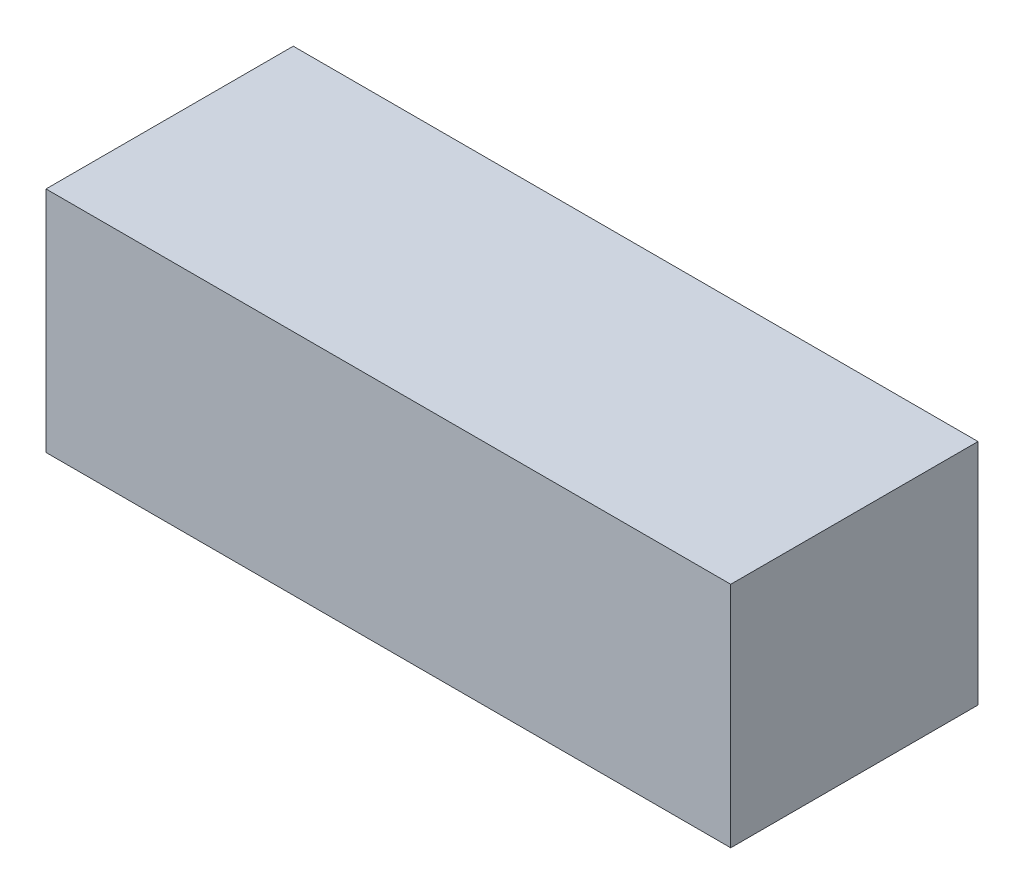
ISO-10303-21;
HEADER;
FILE_DESCRIPTION(('STEP AP214'),'2;1');
FILE_NAME('part.step','',(''),(''),'','','');
FILE_SCHEMA(('AUTOMOTIVE_DESIGN { 1 0 10303 214 1 1 1 1 }'));
ENDSEC;
DATA;
#1=APPLICATION_CONTEXT('core data for automotive mechanical design processes');
#2=APPLICATION_PROTOCOL_DEFINITION('international standard','automotive_design',2000,#1);
#3=PRODUCT_CONTEXT('',#1,'mechanical');
#4=PRODUCT('Part','Part','',(#3));
#5=PRODUCT_RELATED_PRODUCT_CATEGORY('part','',(#4));
#6=PRODUCT_DEFINITION_FORMATION('','',#4);
#7=PRODUCT_DEFINITION_CONTEXT('part definition',#1,'design');
#8=PRODUCT_DEFINITION('design','',#6,#7);
#9=PRODUCT_DEFINITION_SHAPE('','',#8);
#10=(LENGTH_UNIT() NAMED_UNIT(*) SI_UNIT(.MILLI.,.METRE.));
#11=(NAMED_UNIT(*) PLANE_ANGLE_UNIT() SI_UNIT($,.RADIAN.));
#12=(NAMED_UNIT(*) SI_UNIT($,.STERADIAN.) SOLID_ANGLE_UNIT());
#13=UNCERTAINTY_MEASURE_WITH_UNIT(LENGTH_MEASURE(1.E-05),#10,'distance_accuracy_value','');
#14=(GEOMETRIC_REPRESENTATION_CONTEXT(3) GLOBAL_UNCERTAINTY_ASSIGNED_CONTEXT((#13)) GLOBAL_UNIT_ASSIGNED_CONTEXT((#10,
#11,#12)) REPRESENTATION_CONTEXT('',''));
#15=CARTESIAN_POINT('',(0.,0.,0.));
#16=DIRECTION('',(0.,0.,1.));
#17=DIRECTION('',(1.,0.,0.));
#18=AXIS2_PLACEMENT_3D('',#15,#16,#17);
#19=CARTESIAN_POINT('',(90.,60.,32.5));
#20=DIRECTION('',(-1.,0.,0.));
#21=DIRECTION('',(0.,0.,1.));
#22=AXIS2_PLACEMENT_3D('',#19,#20,#21);
#23=PLANE('',#22);
#24=DIRECTION('',(0.,0.,-1.));
#25=VECTOR('',#24,1.);
#26=CARTESIAN_POINT('',(90.,0.,32.5));
#27=LINE('',#26,#25);
#28=CARTESIAN_POINT('',(90.,0.,32.5));
#29=VERTEX_POINT('',#28);
#30=CARTESIAN_POINT('',(90.,0.,-32.5));
#31=VERTEX_POINT('',#30);
#32=EDGE_CURVE('E111',#29,#31,#27,.T.);
#33=ORIENTED_EDGE('',*,*,#32,.T.);
#34=DIRECTION('',(0.,-1.,0.));
#35=VECTOR('',#34,1.);
#36=CARTESIAN_POINT('',(90.,60.,-32.5));
#37=LINE('',#36,#35);
#38=CARTESIAN_POINT('',(90.,60.,-32.5));
#39=VERTEX_POINT('',#38);
#40=EDGE_CURVE('E11',#39,#31,#37,.T.);
#41=ORIENTED_EDGE('',*,*,#40,.F.);
#42=DIRECTION('',(0.,0.,-1.));
#43=VECTOR('',#42,1.);
#44=CARTESIAN_POINT('',(90.,60.,32.5));
#45=LINE('',#44,#43);
#46=CARTESIAN_POINT('',(90.,60.,32.5));
#47=VERTEX_POINT('',#46);
#48=EDGE_CURVE('E95',#47,#39,#45,.T.);
#49=ORIENTED_EDGE('',*,*,#48,.F.);
#50=DIRECTION('',(0.,-1.,0.));
#51=VECTOR('',#50,1.);
#52=CARTESIAN_POINT('',(90.,60.,32.5));
#53=LINE('',#52,#51);
#54=EDGE_CURVE('E107',#47,#29,#53,.T.);
#55=ORIENTED_EDGE('',*,*,#54,.T.);
#56=EDGE_LOOP('',(#33,#41,#49,#55));
#57=FACE_BOUND('',#56,.T.);
#58=ADVANCED_FACE('F43',(#57),#23,.F.);
#59=CARTESIAN_POINT('',(-90.,60.,-32.5));
#60=DIRECTION('',(0.,0.,1.));
#61=DIRECTION('',(1.,0.,0.));
#62=AXIS2_PLACEMENT_3D('',#59,#60,#61);
#63=PLANE('',#62);
#64=DIRECTION('',(-1.,0.,0.));
#65=VECTOR('',#64,1.);
#66=CARTESIAN_POINT('',(-90.,0.,-32.5));
#67=LINE('',#66,#65);
#68=CARTESIAN_POINT('',(-90.,0.,-32.5));
#69=VERTEX_POINT('',#68);
#70=EDGE_CURVE('E100',#31,#69,#67,.T.);
#71=ORIENTED_EDGE('',*,*,#70,.T.);
#72=DIRECTION('',(0.,-1.,0.));
#73=VECTOR('',#72,1.);
#74=CARTESIAN_POINT('',(-90.,60.,-32.5));
#75=LINE('',#74,#73);
#76=CARTESIAN_POINT('',(-90.,60.,-32.5));
#77=VERTEX_POINT('',#76);
#78=EDGE_CURVE('E52',#77,#69,#75,.T.);
#79=ORIENTED_EDGE('',*,*,#78,.F.);
#80=DIRECTION('',(-1.,0.,0.));
#81=VECTOR('',#80,1.);
#82=CARTESIAN_POINT('',(-90.,60.,-32.5));
#83=LINE('',#82,#81);
#84=EDGE_CURVE('E90',#39,#77,#83,.T.);
#85=ORIENTED_EDGE('',*,*,#84,.F.);
#86=ORIENTED_EDGE('',*,*,#40,.T.);
#87=EDGE_LOOP('',(#71,#79,#85,#86));
#88=FACE_BOUND('',#87,.T.);
#89=ADVANCED_FACE('F99',(#88),#63,.F.);
#90=CARTESIAN_POINT('',(-90.,60.,32.5));
#91=DIRECTION('',(1.,0.,0.));
#92=DIRECTION('',(0.,0.,-1.));
#93=AXIS2_PLACEMENT_3D('',#90,#91,#92);
#94=PLANE('',#93);
#95=DIRECTION('',(0.,0.,1.));
#96=VECTOR('',#95,1.);
#97=CARTESIAN_POINT('',(-90.,0.,32.5));
#98=LINE('',#97,#96);
#99=CARTESIAN_POINT('',(-90.,0.,32.5));
#100=VERTEX_POINT('',#99);
#101=EDGE_CURVE('E77',#69,#100,#98,.T.);
#102=ORIENTED_EDGE('',*,*,#101,.T.);
#103=DIRECTION('',(0.,-1.,0.));
#104=VECTOR('',#103,1.);
#105=CARTESIAN_POINT('',(-90.,60.,32.5));
#106=LINE('',#105,#104);
#107=CARTESIAN_POINT('',(-90.,60.,32.5));
#108=VERTEX_POINT('',#107);
#109=EDGE_CURVE('E102',#108,#100,#106,.T.);
#110=ORIENTED_EDGE('',*,*,#109,.F.);
#111=DIRECTION('',(0.,0.,1.));
#112=VECTOR('',#111,1.);
#113=CARTESIAN_POINT('',(-90.,60.,32.5));
#114=LINE('',#113,#112);
#115=EDGE_CURVE('E93',#77,#108,#114,.T.);
#116=ORIENTED_EDGE('',*,*,#115,.F.);
#117=ORIENTED_EDGE('',*,*,#78,.T.);
#118=EDGE_LOOP('',(#102,#110,#116,#117));
#119=FACE_BOUND('',#118,.T.);
#120=ADVANCED_FACE('F103',(#119),#94,.F.);
#121=CARTESIAN_POINT('',(-90.,60.,32.5));
#122=DIRECTION('',(0.,0.,-1.));
#123=DIRECTION('',(-1.,0.,0.));
#124=AXIS2_PLACEMENT_3D('',#121,#122,#123);
#125=PLANE('',#124);
#126=DIRECTION('',(1.,0.,0.));
#127=VECTOR('',#126,1.);
#128=CARTESIAN_POINT('',(-90.,0.,32.5));
#129=LINE('',#128,#127);
#130=EDGE_CURVE('E83',#100,#29,#129,.T.);
#131=ORIENTED_EDGE('',*,*,#130,.T.);
#132=ORIENTED_EDGE('',*,*,#54,.F.);
#133=DIRECTION('',(1.,0.,0.));
#134=VECTOR('',#133,1.);
#135=CARTESIAN_POINT('',(-90.,60.,32.5));
#136=LINE('',#135,#134);
#137=EDGE_CURVE('E60',#108,#47,#136,.T.);
#138=ORIENTED_EDGE('',*,*,#137,.F.);
#139=ORIENTED_EDGE('',*,*,#109,.T.);
#140=EDGE_LOOP('',(#131,#132,#138,#139));
#141=FACE_BOUND('',#140,.T.);
#142=ADVANCED_FACE('F124',(#141),#125,.F.);
#143=CARTESIAN_POINT('',(0.,60.,0.));
#144=DIRECTION('',(0.,-1.,0.));
#145=DIRECTION('',(0.,0.,-1.));
#146=AXIS2_PLACEMENT_3D('',#143,#144,#145);
#147=PLANE('',#146);
#148=ORIENTED_EDGE('',*,*,#48,.T.);
#149=ORIENTED_EDGE('',*,*,#84,.T.);
#150=ORIENTED_EDGE('',*,*,#115,.T.);
#151=ORIENTED_EDGE('',*,*,#137,.T.);
#152=EDGE_LOOP('',(#148,#149,#150,#151));
#153=FACE_BOUND('',#152,.T.);
#154=ADVANCED_FACE('F91',(#153),#147,.F.);
#155=CARTESIAN_POINT('',(0.,0.,0.));
#156=DIRECTION('',(0.,-1.,0.));
#157=DIRECTION('',(0.,0.,-1.));
#158=AXIS2_PLACEMENT_3D('',#155,#156,#157);
#159=PLANE('',#158);
#160=ORIENTED_EDGE('',*,*,#32,.F.);
#161=ORIENTED_EDGE('',*,*,#130,.F.);
#162=ORIENTED_EDGE('',*,*,#101,.F.);
#163=ORIENTED_EDGE('',*,*,#70,.F.);
#164=EDGE_LOOP('',(#160,#161,#162,#163));
#165=FACE_BOUND('',#164,.T.);
#166=ADVANCED_FACE('F127',(#165),#159,.T.);
#167=CLOSED_SHELL('',(#58,#89,#120,#142,#154,#166));
#168=MANIFOLD_SOLID_BREP('B2',#167);
#169=ADVANCED_BREP_SHAPE_REPRESENTATION('',(#18,#168),#14);
#170=SHAPE_DEFINITION_REPRESENTATION(#9,#169);
ENDSEC;
END-ISO-10303-21;
